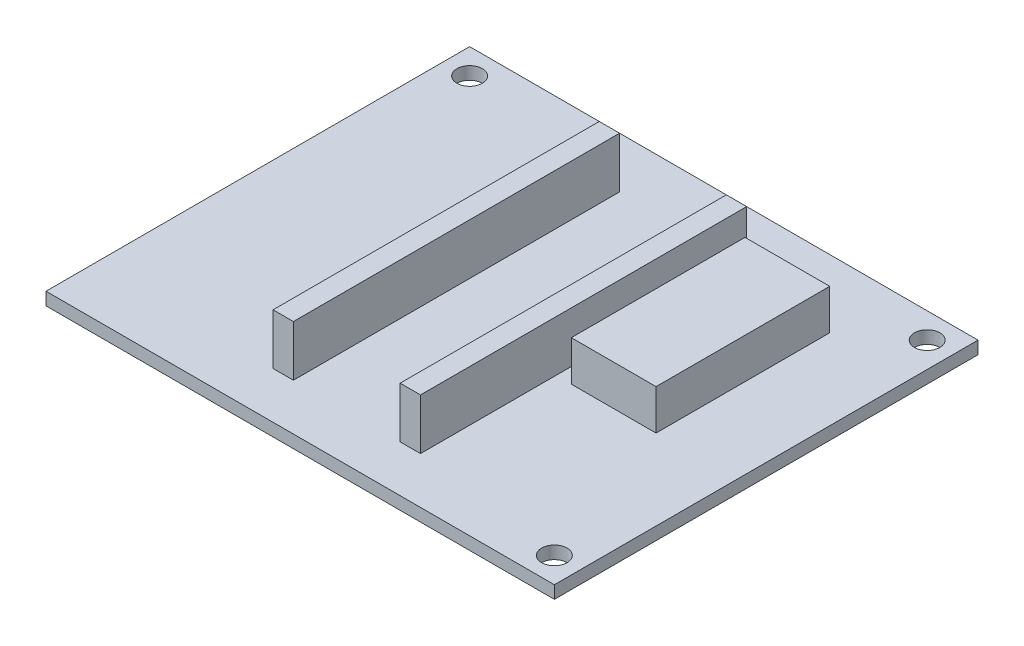
ISO-10303-21;
HEADER;
FILE_DESCRIPTION(('STEP AP214'),'2;1');
FILE_NAME('part.step','',(''),(''),'','','');
FILE_SCHEMA(('AUTOMOTIVE_DESIGN { 1 0 10303 214 1 1 1 1 }'));
ENDSEC;
DATA;
#1=APPLICATION_CONTEXT('core data for automotive mechanical design processes');
#2=APPLICATION_PROTOCOL_DEFINITION('international standard','automotive_design',2000,#1);
#3=PRODUCT_CONTEXT('',#1,'mechanical');
#4=PRODUCT('Part','Part','',(#3));
#5=PRODUCT_RELATED_PRODUCT_CATEGORY('part','',(#4));
#6=PRODUCT_DEFINITION_FORMATION('','',#4);
#7=PRODUCT_DEFINITION_CONTEXT('part definition',#1,'design');
#8=PRODUCT_DEFINITION('design','',#6,#7);
#9=PRODUCT_DEFINITION_SHAPE('','',#8);
#10=(LENGTH_UNIT() NAMED_UNIT(*) SI_UNIT(.MILLI.,.METRE.));
#11=(NAMED_UNIT(*) PLANE_ANGLE_UNIT() SI_UNIT($,.RADIAN.));
#12=(NAMED_UNIT(*) SI_UNIT($,.STERADIAN.) SOLID_ANGLE_UNIT());
#13=UNCERTAINTY_MEASURE_WITH_UNIT(LENGTH_MEASURE(1.E-05),#10,'distance_accuracy_value','');
#14=(GEOMETRIC_REPRESENTATION_CONTEXT(3) GLOBAL_UNCERTAINTY_ASSIGNED_CONTEXT((#13)) GLOBAL_UNIT_ASSIGNED_CONTEXT((#10,
#11,#12)) REPRESENTATION_CONTEXT('',''));
#15=CARTESIAN_POINT('',(0.,0.,0.));
#16=DIRECTION('',(0.,0.,1.));
#17=DIRECTION('',(1.,0.,0.));
#18=AXIS2_PLACEMENT_3D('',#15,#16,#17);
#19=CARTESIAN_POINT('',(20.5,6.25,-17.));
#20=DIRECTION('',(-1.,0.,0.));
#21=DIRECTION('',(0.,0.,1.));
#22=AXIS2_PLACEMENT_3D('',#19,#20,#21);
#23=PLANE('',#22);
#24=DIRECTION('',(0.,0.,-1.));
#25=VECTOR('',#24,1.);
#26=CARTESIAN_POINT('',(20.5,1.5,-17.));
#27=LINE('',#26,#25);
#28=CARTESIAN_POINT('',(20.5,1.5,3.50000000000001));
#29=VERTEX_POINT('',#28);
#30=CARTESIAN_POINT('',(20.5,1.5,-17.));
#31=VERTEX_POINT('',#30);
#32=EDGE_CURVE('E112',#29,#31,#27,.T.);
#33=ORIENTED_EDGE('',*,*,#32,.T.);
#34=DIRECTION('',(0.,-1.,0.));
#35=VECTOR('',#34,1.);
#36=CARTESIAN_POINT('',(20.5,6.25,-17.));
#37=LINE('',#36,#35);
#38=CARTESIAN_POINT('',(20.5,6.25,-17.));
#39=VERTEX_POINT('',#38);
#40=EDGE_CURVE('E12',#39,#31,#37,.T.);
#41=ORIENTED_EDGE('',*,*,#40,.F.);
#42=DIRECTION('',(0.,0.,-1.));
#43=VECTOR('',#42,1.);
#44=CARTESIAN_POINT('',(20.5,6.25,-17.));
#45=LINE('',#44,#43);
#46=CARTESIAN_POINT('',(20.5,6.25,3.50000000000001));
#47=VERTEX_POINT('',#46);
#48=EDGE_CURVE('E100',#47,#39,#45,.T.);
#49=ORIENTED_EDGE('',*,*,#48,.F.);
#50=DIRECTION('',(0.,-1.,0.));
#51=VECTOR('',#50,1.);
#52=CARTESIAN_POINT('',(20.5,6.25,3.50000000000001));
#53=LINE('',#52,#51);
#54=EDGE_CURVE('E108',#47,#29,#53,.T.);
#55=ORIENTED_EDGE('',*,*,#54,.T.);
#56=EDGE_LOOP('',(#33,#41,#49,#55));
#57=FACE_BOUND('',#56,.T.);
#58=ADVANCED_FACE('F49',(#57),#23,.F.);
#59=CARTESIAN_POINT('',(10.5,6.25,-17.));
#60=DIRECTION('',(0.,0.,1.));
#61=DIRECTION('',(1.,0.,0.));
#62=AXIS2_PLACEMENT_3D('',#59,#60,#61);
#63=PLANE('',#62);
#64=DIRECTION('',(-1.,0.,0.));
#65=VECTOR('',#64,1.);
#66=CARTESIAN_POINT('',(10.5,1.5,-17.));
#67=LINE('',#66,#65);
#68=CARTESIAN_POINT('',(10.5,1.5,-17.));
#69=VERTEX_POINT('',#68);
#70=EDGE_CURVE('E104',#31,#69,#67,.T.);
#71=ORIENTED_EDGE('',*,*,#70,.T.);
#72=DIRECTION('',(0.,-1.,0.));
#73=VECTOR('',#72,1.);
#74=CARTESIAN_POINT('',(10.5,6.25,-17.));
#75=LINE('',#74,#73);
#76=CARTESIAN_POINT('',(10.5,6.25,-17.));
#77=VERTEX_POINT('',#76);
#78=EDGE_CURVE('E57',#77,#69,#75,.T.);
#79=ORIENTED_EDGE('',*,*,#78,.F.);
#80=DIRECTION('',(-1.,0.,0.));
#81=VECTOR('',#80,1.);
#82=CARTESIAN_POINT('',(10.5,6.25,-17.));
#83=LINE('',#82,#81);
#84=EDGE_CURVE('E95',#39,#77,#83,.T.);
#85=ORIENTED_EDGE('',*,*,#84,.F.);
#86=ORIENTED_EDGE('',*,*,#40,.T.);
#87=EDGE_LOOP('',(#71,#79,#85,#86));
#88=FACE_BOUND('',#87,.T.);
#89=ADVANCED_FACE('F103',(#88),#63,.F.);
#90=CARTESIAN_POINT('',(10.5,6.25,-17.));
#91=DIRECTION('',(1.,0.,0.));
#92=DIRECTION('',(0.,0.,-1.));
#93=AXIS2_PLACEMENT_3D('',#90,#91,#92);
#94=PLANE('',#93);
#95=DIRECTION('',(0.,0.,1.));
#96=VECTOR('',#95,1.);
#97=CARTESIAN_POINT('',(10.5,1.5,-17.));
#98=LINE('',#97,#96);
#99=CARTESIAN_POINT('',(10.5,1.5,3.50000000000001));
#100=VERTEX_POINT('',#99);
#101=EDGE_CURVE('E82',#69,#100,#98,.T.);
#102=ORIENTED_EDGE('',*,*,#101,.T.);
#103=DIRECTION('',(0.,-1.,0.));
#104=VECTOR('',#103,1.);
#105=CARTESIAN_POINT('',(10.5,6.25,3.50000000000001));
#106=LINE('',#105,#104);
#107=CARTESIAN_POINT('',(10.5,6.25,3.50000000000001));
#108=VERTEX_POINT('',#107);
#109=EDGE_CURVE('E105',#108,#100,#106,.T.);
#110=ORIENTED_EDGE('',*,*,#109,.F.);
#111=DIRECTION('',(0.,0.,1.));
#112=VECTOR('',#111,1.);
#113=CARTESIAN_POINT('',(10.5,6.25,-17.));
#114=LINE('',#113,#112);
#115=EDGE_CURVE('E98',#77,#108,#114,.T.);
#116=ORIENTED_EDGE('',*,*,#115,.F.);
#117=ORIENTED_EDGE('',*,*,#78,.T.);
#118=EDGE_LOOP('',(#102,#110,#116,#117));
#119=FACE_BOUND('',#118,.T.);
#120=ADVANCED_FACE('F106',(#119),#94,.F.);
#121=CARTESIAN_POINT('',(10.5,6.25,3.50000000000001));
#122=DIRECTION('',(0.,0.,-1.));
#123=DIRECTION('',(-1.,0.,0.));
#124=AXIS2_PLACEMENT_3D('',#121,#122,#123);
#125=PLANE('',#124);
#126=DIRECTION('',(1.,0.,0.));
#127=VECTOR('',#126,1.);
#128=CARTESIAN_POINT('',(10.5,1.5,3.50000000000001));
#129=LINE('',#128,#127);
#130=EDGE_CURVE('E88',#100,#29,#129,.T.);
#131=ORIENTED_EDGE('',*,*,#130,.T.);
#132=ORIENTED_EDGE('',*,*,#54,.F.);
#133=DIRECTION('',(1.,0.,0.));
#134=VECTOR('',#133,1.);
#135=CARTESIAN_POINT('',(10.5,6.25,3.50000000000001));
#136=LINE('',#135,#134);
#137=EDGE_CURVE('E65',#108,#47,#136,.T.);
#138=ORIENTED_EDGE('',*,*,#137,.F.);
#139=ORIENTED_EDGE('',*,*,#109,.T.);
#140=EDGE_LOOP('',(#131,#132,#138,#139));
#141=FACE_BOUND('',#140,.T.);
#142=ADVANCED_FACE('F119',(#141),#125,.F.);
#143=CARTESIAN_POINT('',(0.,6.25,0.));
#144=DIRECTION('',(0.,1.,0.));
#145=DIRECTION('',(0.,0.,1.));
#146=AXIS2_PLACEMENT_3D('',#143,#144,#145);
#147=PLANE('',#146);
#148=ORIENTED_EDGE('',*,*,#48,.T.);
#149=ORIENTED_EDGE('',*,*,#84,.T.);
#150=ORIENTED_EDGE('',*,*,#115,.T.);
#151=ORIENTED_EDGE('',*,*,#137,.T.);
#152=EDGE_LOOP('',(#148,#149,#150,#151));
#153=FACE_BOUND('',#152,.T.);
#154=ADVANCED_FACE('F96',(#153),#147,.T.);
#155=CARTESIAN_POINT('',(0.,1.5,0.));
#156=DIRECTION('',(0.,1.,0.));
#157=DIRECTION('',(0.,0.,1.));
#158=AXIS2_PLACEMENT_3D('',#155,#156,#157);
#159=PLANE('',#158);
#160=ORIENTED_EDGE('',*,*,#32,.F.);
#161=ORIENTED_EDGE('',*,*,#130,.F.);
#162=ORIENTED_EDGE('',*,*,#101,.F.);
#163=ORIENTED_EDGE('',*,*,#70,.F.);
#164=EDGE_LOOP('',(#160,#161,#162,#163));
#165=FACE_BOUND('',#164,.T.);
#166=ADVANCED_FACE('F122',(#165),#159,.F.);
#167=CLOSED_SHELL('',(#58,#89,#120,#142,#154,#166));
#168=MANIFOLD_SOLID_BREP('B2',#167);
#169=CARTESIAN_POINT('',(6.3,7.5,-19.));
#170=DIRECTION('',(1.,0.,0.));
#171=DIRECTION('',(0.,0.,-1.));
#172=AXIS2_PLACEMENT_3D('',#169,#170,#171);
#173=PLANE('',#172);
#174=DIRECTION('',(0.,0.,1.));
#175=VECTOR('',#174,1.);
#176=CARTESIAN_POINT('',(6.3,1.5,-19.));
#177=LINE('',#176,#175);
#178=CARTESIAN_POINT('',(6.3,1.5,-19.));
#179=VERTEX_POINT('',#178);
#180=CARTESIAN_POINT('',(6.30000000000001,1.5,19.5));
#181=VERTEX_POINT('',#180);
#182=EDGE_CURVE('E245',#179,#181,#177,.T.);
#183=ORIENTED_EDGE('',*,*,#182,.T.);
#184=DIRECTION('',(0.,-1.,0.));
#185=VECTOR('',#184,1.);
#186=CARTESIAN_POINT('',(6.30000000000001,7.5,19.5));
#187=LINE('',#186,#185);
#188=CARTESIAN_POINT('',(6.30000000000001,7.5,19.5));
#189=VERTEX_POINT('',#188);
#190=EDGE_CURVE('E47',#189,#181,#187,.T.);
#191=ORIENTED_EDGE('',*,*,#190,.F.);
#192=DIRECTION('',(0.,0.,1.));
#193=VECTOR('',#192,1.);
#194=CARTESIAN_POINT('',(6.3,7.5,-19.));
#195=LINE('',#194,#193);
#196=CARTESIAN_POINT('',(6.3,7.5,-19.));
#197=VERTEX_POINT('',#196);
#198=EDGE_CURVE('E233',#197,#189,#195,.T.);
#199=ORIENTED_EDGE('',*,*,#198,.F.);
#200=DIRECTION('',(0.,-1.,0.));
#201=VECTOR('',#200,1.);
#202=CARTESIAN_POINT('',(6.3,7.5,-19.));
#203=LINE('',#202,#201);
#204=EDGE_CURVE('E241',#197,#179,#203,.T.);
#205=ORIENTED_EDGE('',*,*,#204,.T.);
#206=EDGE_LOOP('',(#183,#191,#199,#205));
#207=FACE_BOUND('',#206,.T.);
#208=ADVANCED_FACE('F182',(#207),#173,.F.);
#209=CARTESIAN_POINT('',(6.30000000000001,7.5,19.5));
#210=DIRECTION('',(0.,0.,-1.));
#211=DIRECTION('',(-1.,0.,0.));
#212=AXIS2_PLACEMENT_3D('',#209,#210,#211);
#213=PLANE('',#212);
#214=DIRECTION('',(1.,0.,0.));
#215=VECTOR('',#214,1.);
#216=CARTESIAN_POINT('',(6.30000000000001,1.5,19.5));
#217=LINE('',#216,#215);
#218=CARTESIAN_POINT('',(8.70000000000001,1.5,19.5));
#219=VERTEX_POINT('',#218);
#220=EDGE_CURVE('E237',#181,#219,#217,.T.);
#221=ORIENTED_EDGE('',*,*,#220,.T.);
#222=DIRECTION('',(0.,-1.,0.));
#223=VECTOR('',#222,1.);
#224=CARTESIAN_POINT('',(8.70000000000001,7.5,19.5));
#225=LINE('',#224,#223);
#226=CARTESIAN_POINT('',(8.70000000000001,7.5,19.5));
#227=VERTEX_POINT('',#226);
#228=EDGE_CURVE('E190',#227,#219,#225,.T.);
#229=ORIENTED_EDGE('',*,*,#228,.F.);
#230=DIRECTION('',(1.,0.,0.));
#231=VECTOR('',#230,1.);
#232=CARTESIAN_POINT('',(6.30000000000001,7.5,19.5));
#233=LINE('',#232,#231);
#234=EDGE_CURVE('E228',#189,#227,#233,.T.);
#235=ORIENTED_EDGE('',*,*,#234,.F.);
#236=ORIENTED_EDGE('',*,*,#190,.T.);
#237=EDGE_LOOP('',(#221,#229,#235,#236));
#238=FACE_BOUND('',#237,.T.);
#239=ADVANCED_FACE('F236',(#238),#213,.F.);
#240=CARTESIAN_POINT('',(8.7,7.5,-19.));
#241=DIRECTION('',(-1.,0.,0.));
#242=DIRECTION('',(0.,0.,1.));
#243=AXIS2_PLACEMENT_3D('',#240,#241,#242);
#244=PLANE('',#243);
#245=DIRECTION('',(0.,0.,-1.));
#246=VECTOR('',#245,1.);
#247=CARTESIAN_POINT('',(8.7,1.5,-19.));
#248=LINE('',#247,#246);
#249=CARTESIAN_POINT('',(8.7,1.5,-19.));
#250=VERTEX_POINT('',#249);
#251=EDGE_CURVE('E215',#219,#250,#248,.T.);
#252=ORIENTED_EDGE('',*,*,#251,.T.);
#253=DIRECTION('',(0.,-1.,0.));
#254=VECTOR('',#253,1.);
#255=CARTESIAN_POINT('',(8.7,7.5,-19.));
#256=LINE('',#255,#254);
#257=CARTESIAN_POINT('',(8.7,7.5,-19.));
#258=VERTEX_POINT('',#257);
#259=EDGE_CURVE('E238',#258,#250,#256,.T.);
#260=ORIENTED_EDGE('',*,*,#259,.F.);
#261=DIRECTION('',(0.,0.,-1.));
#262=VECTOR('',#261,1.);
#263=CARTESIAN_POINT('',(8.7,7.5,-19.));
#264=LINE('',#263,#262);
#265=EDGE_CURVE('E231',#227,#258,#264,.T.);
#266=ORIENTED_EDGE('',*,*,#265,.F.);
#267=ORIENTED_EDGE('',*,*,#228,.T.);
#268=EDGE_LOOP('',(#252,#260,#266,#267));
#269=FACE_BOUND('',#268,.T.);
#270=ADVANCED_FACE('F239',(#269),#244,.F.);
#271=CARTESIAN_POINT('',(6.3,7.5,-19.));
#272=DIRECTION('',(0.,0.,1.));
#273=DIRECTION('',(1.,0.,0.));
#274=AXIS2_PLACEMENT_3D('',#271,#272,#273);
#275=PLANE('',#274);
#276=DIRECTION('',(-1.,0.,0.));
#277=VECTOR('',#276,1.);
#278=CARTESIAN_POINT('',(6.3,1.5,-19.));
#279=LINE('',#278,#277);
#280=EDGE_CURVE('E221',#250,#179,#279,.T.);
#281=ORIENTED_EDGE('',*,*,#280,.T.);
#282=ORIENTED_EDGE('',*,*,#204,.F.);
#283=DIRECTION('',(-1.,0.,0.));
#284=VECTOR('',#283,1.);
#285=CARTESIAN_POINT('',(6.3,7.5,-19.));
#286=LINE('',#285,#284);
#287=EDGE_CURVE('E198',#258,#197,#286,.T.);
#288=ORIENTED_EDGE('',*,*,#287,.F.);
#289=ORIENTED_EDGE('',*,*,#259,.T.);
#290=EDGE_LOOP('',(#281,#282,#288,#289));
#291=FACE_BOUND('',#290,.T.);
#292=ADVANCED_FACE('F252',(#291),#275,.F.);
#293=CARTESIAN_POINT('',(0.,7.5,0.));
#294=DIRECTION('',(0.,1.,0.));
#295=DIRECTION('',(0.,0.,1.));
#296=AXIS2_PLACEMENT_3D('',#293,#294,#295);
#297=PLANE('',#296);
#298=ORIENTED_EDGE('',*,*,#198,.T.);
#299=ORIENTED_EDGE('',*,*,#234,.T.);
#300=ORIENTED_EDGE('',*,*,#265,.T.);
#301=ORIENTED_EDGE('',*,*,#287,.T.);
#302=EDGE_LOOP('',(#298,#299,#300,#301));
#303=FACE_BOUND('',#302,.T.);
#304=ADVANCED_FACE('F229',(#303),#297,.T.);
#305=CARTESIAN_POINT('',(0.,1.5,0.));
#306=DIRECTION('',(0.,1.,0.));
#307=DIRECTION('',(0.,0.,1.));
#308=AXIS2_PLACEMENT_3D('',#305,#306,#307);
#309=PLANE('',#308);
#310=ORIENTED_EDGE('',*,*,#182,.F.);
#311=ORIENTED_EDGE('',*,*,#280,.F.);
#312=ORIENTED_EDGE('',*,*,#251,.F.);
#313=ORIENTED_EDGE('',*,*,#220,.F.);
#314=EDGE_LOOP('',(#310,#311,#312,#313));
#315=FACE_BOUND('',#314,.T.);
#316=ADVANCED_FACE('F255',(#315),#309,.F.);
#317=CLOSED_SHELL('',(#208,#239,#270,#292,#304,#316));
#318=MANIFOLD_SOLID_BREP('B6',#317);
#319=CARTESIAN_POINT('',(-8.7,7.5,-19.));
#320=DIRECTION('',(1.,0.,0.));
#321=DIRECTION('',(0.,0.,-1.));
#322=AXIS2_PLACEMENT_3D('',#319,#320,#321);
#323=PLANE('',#322);
#324=DIRECTION('',(0.,0.,1.));
#325=VECTOR('',#324,1.);
#326=CARTESIAN_POINT('',(-8.7,1.5,-19.));
#327=LINE('',#326,#325);
#328=CARTESIAN_POINT('',(-8.7,1.5,-19.));
#329=VERTEX_POINT('',#328);
#330=CARTESIAN_POINT('',(-8.69999999999999,1.5,19.5));
#331=VERTEX_POINT('',#330);
#332=EDGE_CURVE('E377',#329,#331,#327,.T.);
#333=ORIENTED_EDGE('',*,*,#332,.T.);
#334=DIRECTION('',(0.,-1.,0.));
#335=VECTOR('',#334,1.);
#336=CARTESIAN_POINT('',(-8.69999999999999,7.5,19.5));
#337=LINE('',#336,#335);
#338=CARTESIAN_POINT('',(-8.69999999999999,7.5,19.5));
#339=VERTEX_POINT('',#338);
#340=EDGE_CURVE('E180',#339,#331,#337,.T.);
#341=ORIENTED_EDGE('',*,*,#340,.F.);
#342=DIRECTION('',(0.,0.,1.));
#343=VECTOR('',#342,1.);
#344=CARTESIAN_POINT('',(-8.7,7.5,-19.));
#345=LINE('',#344,#343);
#346=CARTESIAN_POINT('',(-8.7,7.5,-19.));
#347=VERTEX_POINT('',#346);
#348=EDGE_CURVE('E365',#347,#339,#345,.T.);
#349=ORIENTED_EDGE('',*,*,#348,.F.);
#350=DIRECTION('',(0.,-1.,0.));
#351=VECTOR('',#350,1.);
#352=CARTESIAN_POINT('',(-8.7,7.5,-19.));
#353=LINE('',#352,#351);
#354=EDGE_CURVE('E373',#347,#329,#353,.T.);
#355=ORIENTED_EDGE('',*,*,#354,.T.);
#356=EDGE_LOOP('',(#333,#341,#349,#355));
#357=FACE_BOUND('',#356,.T.);
#358=ADVANCED_FACE('F314',(#357),#323,.F.);
#359=CARTESIAN_POINT('',(-8.69999999999999,7.5,19.5));
#360=DIRECTION('',(0.,0.,-1.));
#361=DIRECTION('',(-1.,0.,0.));
#362=AXIS2_PLACEMENT_3D('',#359,#360,#361);
#363=PLANE('',#362);
#364=DIRECTION('',(1.,0.,0.));
#365=VECTOR('',#364,1.);
#366=CARTESIAN_POINT('',(-8.69999999999999,1.5,19.5));
#367=LINE('',#366,#365);
#368=CARTESIAN_POINT('',(-6.29999999999999,1.5,19.5));
#369=VERTEX_POINT('',#368);
#370=EDGE_CURVE('E369',#331,#369,#367,.T.);
#371=ORIENTED_EDGE('',*,*,#370,.T.);
#372=DIRECTION('',(0.,-1.,0.));
#373=VECTOR('',#372,1.);
#374=CARTESIAN_POINT('',(-6.29999999999999,7.5,19.5));
#375=LINE('',#374,#373);
#376=CARTESIAN_POINT('',(-6.29999999999999,7.5,19.5));
#377=VERTEX_POINT('',#376);
#378=EDGE_CURVE('E322',#377,#369,#375,.T.);
#379=ORIENTED_EDGE('',*,*,#378,.F.);
#380=DIRECTION('',(1.,0.,0.));
#381=VECTOR('',#380,1.);
#382=CARTESIAN_POINT('',(-8.69999999999999,7.5,19.5));
#383=LINE('',#382,#381);
#384=EDGE_CURVE('E360',#339,#377,#383,.T.);
#385=ORIENTED_EDGE('',*,*,#384,.F.);
#386=ORIENTED_EDGE('',*,*,#340,.T.);
#387=EDGE_LOOP('',(#371,#379,#385,#386));
#388=FACE_BOUND('',#387,.T.);
#389=ADVANCED_FACE('F368',(#388),#363,.F.);
#390=CARTESIAN_POINT('',(-6.3,7.5,-19.));
#391=DIRECTION('',(-1.,0.,0.));
#392=DIRECTION('',(0.,0.,1.));
#393=AXIS2_PLACEMENT_3D('',#390,#391,#392);
#394=PLANE('',#393);
#395=DIRECTION('',(0.,0.,-1.));
#396=VECTOR('',#395,1.);
#397=CARTESIAN_POINT('',(-6.3,1.5,-19.));
#398=LINE('',#397,#396);
#399=CARTESIAN_POINT('',(-6.3,1.5,-19.));
#400=VERTEX_POINT('',#399);
#401=EDGE_CURVE('E347',#369,#400,#398,.T.);
#402=ORIENTED_EDGE('',*,*,#401,.T.);
#403=DIRECTION('',(0.,-1.,0.));
#404=VECTOR('',#403,1.);
#405=CARTESIAN_POINT('',(-6.3,7.5,-19.));
#406=LINE('',#405,#404);
#407=CARTESIAN_POINT('',(-6.3,7.5,-19.));
#408=VERTEX_POINT('',#407);
#409=EDGE_CURVE('E370',#408,#400,#406,.T.);
#410=ORIENTED_EDGE('',*,*,#409,.F.);
#411=DIRECTION('',(0.,0.,-1.));
#412=VECTOR('',#411,1.);
#413=CARTESIAN_POINT('',(-6.3,7.5,-19.));
#414=LINE('',#413,#412);
#415=EDGE_CURVE('E363',#377,#408,#414,.T.);
#416=ORIENTED_EDGE('',*,*,#415,.F.);
#417=ORIENTED_EDGE('',*,*,#378,.T.);
#418=EDGE_LOOP('',(#402,#410,#416,#417));
#419=FACE_BOUND('',#418,.T.);
#420=ADVANCED_FACE('F371',(#419),#394,.F.);
#421=CARTESIAN_POINT('',(-8.7,7.5,-19.));
#422=DIRECTION('',(0.,0.,1.));
#423=DIRECTION('',(1.,0.,0.));
#424=AXIS2_PLACEMENT_3D('',#421,#422,#423);
#425=PLANE('',#424);
#426=DIRECTION('',(-1.,0.,0.));
#427=VECTOR('',#426,1.);
#428=CARTESIAN_POINT('',(-8.7,1.5,-19.));
#429=LINE('',#428,#427);
#430=EDGE_CURVE('E353',#400,#329,#429,.T.);
#431=ORIENTED_EDGE('',*,*,#430,.T.);
#432=ORIENTED_EDGE('',*,*,#354,.F.);
#433=DIRECTION('',(-1.,0.,0.));
#434=VECTOR('',#433,1.);
#435=CARTESIAN_POINT('',(-8.7,7.5,-19.));
#436=LINE('',#435,#434);
#437=EDGE_CURVE('E330',#408,#347,#436,.T.);
#438=ORIENTED_EDGE('',*,*,#437,.F.);
#439=ORIENTED_EDGE('',*,*,#409,.T.);
#440=EDGE_LOOP('',(#431,#432,#438,#439));
#441=FACE_BOUND('',#440,.T.);
#442=ADVANCED_FACE('F384',(#441),#425,.F.);
#443=CARTESIAN_POINT('',(0.,7.5,0.));
#444=DIRECTION('',(0.,1.,0.));
#445=DIRECTION('',(0.,0.,1.));
#446=AXIS2_PLACEMENT_3D('',#443,#444,#445);
#447=PLANE('',#446);
#448=ORIENTED_EDGE('',*,*,#348,.T.);
#449=ORIENTED_EDGE('',*,*,#384,.T.);
#450=ORIENTED_EDGE('',*,*,#415,.T.);
#451=ORIENTED_EDGE('',*,*,#437,.T.);
#452=EDGE_LOOP('',(#448,#449,#450,#451));
#453=FACE_BOUND('',#452,.T.);
#454=ADVANCED_FACE('F361',(#453),#447,.T.);
#455=CARTESIAN_POINT('',(0.,1.5,0.));
#456=DIRECTION('',(0.,1.,0.));
#457=DIRECTION('',(0.,0.,1.));
#458=AXIS2_PLACEMENT_3D('',#455,#456,#457);
#459=PLANE('',#458);
#460=ORIENTED_EDGE('',*,*,#332,.F.);
#461=ORIENTED_EDGE('',*,*,#430,.F.);
#462=ORIENTED_EDGE('',*,*,#401,.F.);
#463=ORIENTED_EDGE('',*,*,#370,.F.);
#464=EDGE_LOOP('',(#460,#461,#462,#463));
#465=FACE_BOUND('',#464,.T.);
#466=ADVANCED_FACE('F387',(#465),#459,.F.);
#467=CLOSED_SHELL('',(#358,#389,#420,#442,#454,#466));
#468=MANIFOLD_SOLID_BREP('B41',#467);
#469=CARTESIAN_POINT('',(0.,1.5,0.));
#470=DIRECTION('',(0.,1.,0.));
#471=DIRECTION('',(0.,0.,1.));
#472=AXIS2_PLACEMENT_3D('',#469,#470,#471);
#473=PLANE('',#472);
#474=CARTESIAN_POINT('',(27.,1.5,-22.));
#475=DIRECTION('',(0.,1.,0.));
#476=DIRECTION('',(0.,0.,-1.));
#477=AXIS2_PLACEMENT_3D('',#474,#475,#476);
#478=CIRCLE('',#477,1.5);
#479=CARTESIAN_POINT('',(27.,1.5,-23.5));
#480=VERTEX_POINT('',#479);
#481=EDGE_CURVE('E519',#480,#480,#478,.T.);
#482=ORIENTED_EDGE('',*,*,#481,.F.);
#483=EDGE_LOOP('',(#482));
#484=FACE_BOUND('',#483,.T.);
#485=DIRECTION('',(0.,0.,1.));
#486=VECTOR('',#485,1.);
#487=CARTESIAN_POINT('',(-30.,1.5,25.));
#488=LINE('',#487,#486);
#489=CARTESIAN_POINT('',(-30.,1.5,-25.));
#490=VERTEX_POINT('',#489);
#491=CARTESIAN_POINT('',(-30.,1.5,25.));
#492=VERTEX_POINT('',#491);
#493=EDGE_CURVE('E489',#490,#492,#488,.T.);
#494=ORIENTED_EDGE('',*,*,#493,.T.);
#495=DIRECTION('',(1.,0.,0.));
#496=VECTOR('',#495,1.);
#497=CARTESIAN_POINT('',(30.,1.5,25.));
#498=LINE('',#497,#496);
#499=CARTESIAN_POINT('',(30.,1.5,25.));
#500=VERTEX_POINT('',#499);
#501=EDGE_CURVE('E484',#492,#500,#498,.T.);
#502=ORIENTED_EDGE('',*,*,#501,.T.);
#503=DIRECTION('',(0.,0.,-1.));
#504=VECTOR('',#503,1.);
#505=CARTESIAN_POINT('',(30.,1.5,25.));
#506=LINE('',#505,#504);
#507=CARTESIAN_POINT('',(30.,1.5,-25.));
#508=VERTEX_POINT('',#507);
#509=EDGE_CURVE('E487',#500,#508,#506,.T.);
#510=ORIENTED_EDGE('',*,*,#509,.T.);
#511=DIRECTION('',(-1.,0.,0.));
#512=VECTOR('',#511,1.);
#513=CARTESIAN_POINT('',(30.,1.5,-25.));
#514=LINE('',#513,#512);
#515=EDGE_CURVE('E454',#508,#490,#514,.T.);
#516=ORIENTED_EDGE('',*,*,#515,.T.);
#517=EDGE_LOOP('',(#494,#502,#510,#516));
#518=FACE_BOUND('',#517,.T.);
#519=CARTESIAN_POINT('',(-27.,1.5,-22.));
#520=DIRECTION('',(0.,1.,0.));
#521=DIRECTION('',(0.,0.,1.));
#522=AXIS2_PLACEMENT_3D('',#519,#520,#521);
#523=CIRCLE('',#522,1.5);
#524=CARTESIAN_POINT('',(-27.,1.5,-20.5));
#525=VERTEX_POINT('',#524);
#526=EDGE_CURVE('E504',#525,#525,#523,.T.);
#527=ORIENTED_EDGE('',*,*,#526,.F.);
#528=EDGE_LOOP('',(#527));
#529=FACE_BOUND('',#528,.T.);
#530=CARTESIAN_POINT('',(27.,1.5,22.));
#531=DIRECTION('',(0.,1.,0.));
#532=DIRECTION('',(0.,0.,1.));
#533=AXIS2_PLACEMENT_3D('',#530,#531,#532);
#534=CIRCLE('',#533,1.5);
#535=CARTESIAN_POINT('',(27.,1.5,23.5));
#536=VERTEX_POINT('',#535);
#537=EDGE_CURVE('E525',#536,#536,#534,.T.);
#538=ORIENTED_EDGE('',*,*,#537,.F.);
#539=EDGE_LOOP('',(#538));
#540=FACE_BOUND('',#539,.T.);
#541=ADVANCED_FACE('F437',(#484,#518,#529,#540),#473,.T.);
#542=CARTESIAN_POINT('',(0.,0.,0.));
#543=DIRECTION('',(0.,1.,0.));
#544=DIRECTION('',(0.,0.,1.));
#545=AXIS2_PLACEMENT_3D('',#542,#543,#544);
#546=PLANE('',#545);
#547=DIRECTION('',(0.,0.,1.));
#548=VECTOR('',#547,1.);
#549=CARTESIAN_POINT('',(-30.,0.,25.));
#550=LINE('',#549,#548);
#551=CARTESIAN_POINT('',(-30.,0.,-25.));
#552=VERTEX_POINT('',#551);
#553=CARTESIAN_POINT('',(-30.,0.,25.));
#554=VERTEX_POINT('',#553);
#555=EDGE_CURVE('E501',#552,#554,#550,.T.);
#556=ORIENTED_EDGE('',*,*,#555,.F.);
#557=DIRECTION('',(-1.,0.,0.));
#558=VECTOR('',#557,1.);
#559=CARTESIAN_POINT('',(30.,0.,-25.));
#560=LINE('',#559,#558);
#561=CARTESIAN_POINT('',(30.,0.,-25.));
#562=VERTEX_POINT('',#561);
#563=EDGE_CURVE('E477',#562,#552,#560,.T.);
#564=ORIENTED_EDGE('',*,*,#563,.F.);
#565=DIRECTION('',(0.,0.,-1.));
#566=VECTOR('',#565,1.);
#567=CARTESIAN_POINT('',(30.,0.,25.));
#568=LINE('',#567,#566);
#569=CARTESIAN_POINT('',(30.,0.,25.));
#570=VERTEX_POINT('',#569);
#571=EDGE_CURVE('E471',#570,#562,#568,.T.);
#572=ORIENTED_EDGE('',*,*,#571,.F.);
#573=DIRECTION('',(1.,0.,0.));
#574=VECTOR('',#573,1.);
#575=CARTESIAN_POINT('',(30.,0.,25.));
#576=LINE('',#575,#574);
#577=EDGE_CURVE('E493',#554,#570,#576,.T.);
#578=ORIENTED_EDGE('',*,*,#577,.F.);
#579=EDGE_LOOP('',(#556,#564,#572,#578));
#580=FACE_BOUND('',#579,.T.);
#581=CARTESIAN_POINT('',(-27.,0.,-22.));
#582=DIRECTION('',(0.,1.,0.));
#583=DIRECTION('',(0.,0.,1.));
#584=AXIS2_PLACEMENT_3D('',#581,#582,#583);
#585=CIRCLE('',#584,1.5);
#586=CARTESIAN_POINT('',(-27.,0.,-20.5));
#587=VERTEX_POINT('',#586);
#588=EDGE_CURVE('E516',#587,#587,#585,.T.);
#589=ORIENTED_EDGE('',*,*,#588,.T.);
#590=EDGE_LOOP('',(#589));
#591=FACE_BOUND('',#590,.T.);
#592=CARTESIAN_POINT('',(27.,0.,-22.));
#593=DIRECTION('',(0.,1.,0.));
#594=DIRECTION('',(0.,0.,-1.));
#595=AXIS2_PLACEMENT_3D('',#592,#593,#594);
#596=CIRCLE('',#595,1.5);
#597=CARTESIAN_POINT('',(27.,0.,-23.5));
#598=VERTEX_POINT('',#597);
#599=EDGE_CURVE('E522',#598,#598,#596,.T.);
#600=ORIENTED_EDGE('',*,*,#599,.T.);
#601=EDGE_LOOP('',(#600));
#602=FACE_BOUND('',#601,.T.);
#603=CARTESIAN_POINT('',(27.,0.,22.));
#604=DIRECTION('',(0.,1.,0.));
#605=DIRECTION('',(0.,0.,1.));
#606=AXIS2_PLACEMENT_3D('',#603,#604,#605);
#607=CIRCLE('',#606,1.5);
#608=CARTESIAN_POINT('',(27.,0.,23.5));
#609=VERTEX_POINT('',#608);
#610=EDGE_CURVE('E528',#609,#609,#607,.T.);
#611=ORIENTED_EDGE('',*,*,#610,.T.);
#612=EDGE_LOOP('',(#611));
#613=FACE_BOUND('',#612,.T.);
#614=ADVANCED_FACE('F512',(#580,#591,#602,#613),#546,.F.);
#615=CARTESIAN_POINT('',(-30.,1.5,25.));
#616=DIRECTION('',(1.,0.,0.));
#617=DIRECTION('',(0.,0.,-1.));
#618=AXIS2_PLACEMENT_3D('',#615,#616,#617);
#619=PLANE('',#618);
#620=ORIENTED_EDGE('',*,*,#555,.T.);
#621=DIRECTION('',(0.,-1.,0.));
#622=VECTOR('',#621,1.);
#623=CARTESIAN_POINT('',(-30.,1.5,25.));
#624=LINE('',#623,#622);
#625=EDGE_CURVE('E312',#492,#554,#624,.T.);
#626=ORIENTED_EDGE('',*,*,#625,.F.);
#627=ORIENTED_EDGE('',*,*,#493,.F.);
#628=DIRECTION('',(0.,-1.,0.));
#629=VECTOR('',#628,1.);
#630=CARTESIAN_POINT('',(-30.,1.5,-25.));
#631=LINE('',#630,#629);
#632=EDGE_CURVE('E497',#490,#552,#631,.T.);
#633=ORIENTED_EDGE('',*,*,#632,.T.);
#634=EDGE_LOOP('',(#620,#626,#627,#633));
#635=FACE_BOUND('',#634,.T.);
#636=ADVANCED_FACE('F439',(#635),#619,.F.);
#637=CARTESIAN_POINT('',(30.,1.5,25.));
#638=DIRECTION('',(0.,0.,-1.));
#639=DIRECTION('',(-1.,0.,0.));
#640=AXIS2_PLACEMENT_3D('',#637,#638,#639);
#641=PLANE('',#640);
#642=ORIENTED_EDGE('',*,*,#577,.T.);
#643=DIRECTION('',(0.,-1.,0.));
#644=VECTOR('',#643,1.);
#645=CARTESIAN_POINT('',(30.,1.5,25.));
#646=LINE('',#645,#644);
#647=EDGE_CURVE('E446',#500,#570,#646,.T.);
#648=ORIENTED_EDGE('',*,*,#647,.F.);
#649=ORIENTED_EDGE('',*,*,#501,.F.);
#650=ORIENTED_EDGE('',*,*,#625,.T.);
#651=EDGE_LOOP('',(#642,#648,#649,#650));
#652=FACE_BOUND('',#651,.T.);
#653=ADVANCED_FACE('F492',(#652),#641,.F.);
#654=CARTESIAN_POINT('',(30.,1.5,25.));
#655=DIRECTION('',(-1.,0.,0.));
#656=DIRECTION('',(0.,0.,1.));
#657=AXIS2_PLACEMENT_3D('',#654,#655,#656);
#658=PLANE('',#657);
#659=ORIENTED_EDGE('',*,*,#571,.T.);
#660=DIRECTION('',(0.,-1.,0.));
#661=VECTOR('',#660,1.);
#662=CARTESIAN_POINT('',(30.,1.5,-25.));
#663=LINE('',#662,#661);
#664=EDGE_CURVE('E494',#508,#562,#663,.T.);
#665=ORIENTED_EDGE('',*,*,#664,.F.);
#666=ORIENTED_EDGE('',*,*,#509,.F.);
#667=ORIENTED_EDGE('',*,*,#647,.T.);
#668=EDGE_LOOP('',(#659,#665,#666,#667));
#669=FACE_BOUND('',#668,.T.);
#670=ADVANCED_FACE('F495',(#669),#658,.F.);
#671=CARTESIAN_POINT('',(30.,1.5,-25.));
#672=DIRECTION('',(0.,0.,1.));
#673=DIRECTION('',(1.,0.,0.));
#674=AXIS2_PLACEMENT_3D('',#671,#672,#673);
#675=PLANE('',#674);
#676=ORIENTED_EDGE('',*,*,#563,.T.);
#677=ORIENTED_EDGE('',*,*,#632,.F.);
#678=ORIENTED_EDGE('',*,*,#515,.F.);
#679=ORIENTED_EDGE('',*,*,#664,.T.);
#680=EDGE_LOOP('',(#676,#677,#678,#679));
#681=FACE_BOUND('',#680,.T.);
#682=ADVANCED_FACE('F509',(#681),#675,.F.);
#683=CARTESIAN_POINT('',(-27.,1.5,-22.));
#684=DIRECTION('',(0.,-1.,0.));
#685=DIRECTION('',(0.,0.,-1.));
#686=AXIS2_PLACEMENT_3D('',#683,#684,#685);
#687=CYLINDRICAL_SURFACE('',#686,1.5);
#688=ORIENTED_EDGE('',*,*,#526,.T.);
#689=EDGE_LOOP('',(#688));
#690=FACE_BOUND('',#689,.T.);
#691=ORIENTED_EDGE('',*,*,#588,.F.);
#692=EDGE_LOOP('',(#691));
#693=FACE_BOUND('',#692,.T.);
#694=ADVANCED_FACE('F546',(#690,#693),#687,.F.);
#695=CARTESIAN_POINT('',(27.,1.5,-22.));
#696=DIRECTION('',(0.,-1.,0.));
#697=DIRECTION('',(0.,0.,-1.));
#698=AXIS2_PLACEMENT_3D('',#695,#696,#697);
#699=CYLINDRICAL_SURFACE('',#698,1.5);
#700=ORIENTED_EDGE('',*,*,#481,.T.);
#701=EDGE_LOOP('',(#700));
#702=FACE_BOUND('',#701,.T.);
#703=ORIENTED_EDGE('',*,*,#599,.F.);
#704=EDGE_LOOP('',(#703));
#705=FACE_BOUND('',#704,.T.);
#706=ADVANCED_FACE('F592',(#702,#705),#699,.F.);
#707=CARTESIAN_POINT('',(27.,1.5,22.));
#708=DIRECTION('',(0.,-1.,0.));
#709=DIRECTION('',(0.,0.,-1.));
#710=AXIS2_PLACEMENT_3D('',#707,#708,#709);
#711=CYLINDRICAL_SURFACE('',#710,1.5);
#712=ORIENTED_EDGE('',*,*,#537,.T.);
#713=EDGE_LOOP('',(#712));
#714=FACE_BOUND('',#713,.T.);
#715=ORIENTED_EDGE('',*,*,#610,.F.);
#716=EDGE_LOOP('',(#715));
#717=FACE_BOUND('',#716,.T.);
#718=ADVANCED_FACE('F534',(#714,#717),#711,.F.);
#719=CLOSED_SHELL('',(#541,#614,#636,#653,#670,#682,#694,#706,#718));
#720=MANIFOLD_SOLID_BREP('B174',#719);
#721=ADVANCED_BREP_SHAPE_REPRESENTATION('',(#18,#168,#318,#468,#720),#14);
#722=SHAPE_DEFINITION_REPRESENTATION(#9,#721);
ENDSEC;
END-ISO-10303-21;
